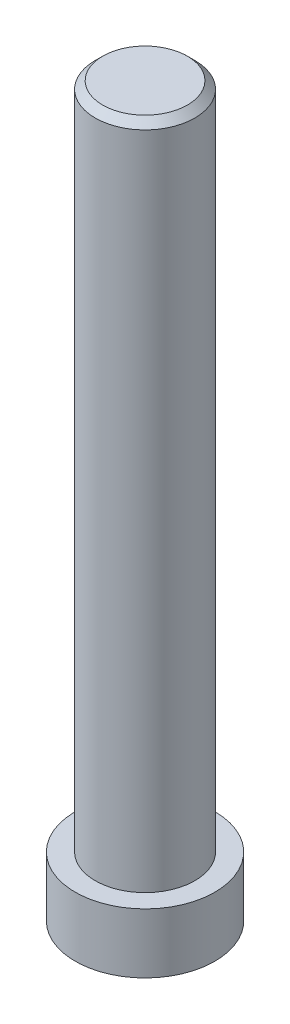
ISO-10303-21;
HEADER;
FILE_DESCRIPTION(('STEP AP214'),'2;1');
FILE_NAME('part.step','',(''),(''),'','','');
FILE_SCHEMA(('AUTOMOTIVE_DESIGN { 1 0 10303 214 1 1 1 1 }'));
ENDSEC;
DATA;
#1=APPLICATION_CONTEXT('core data for automotive mechanical design processes');
#2=APPLICATION_PROTOCOL_DEFINITION('international standard','automotive_design',2000,#1);
#3=PRODUCT_CONTEXT('',#1,'mechanical');
#4=PRODUCT('Part','Part','',(#3));
#5=PRODUCT_RELATED_PRODUCT_CATEGORY('part','',(#4));
#6=PRODUCT_DEFINITION_FORMATION('','',#4);
#7=PRODUCT_DEFINITION_CONTEXT('part definition',#1,'design');
#8=PRODUCT_DEFINITION('design','',#6,#7);
#9=PRODUCT_DEFINITION_SHAPE('','',#8);
#10=(LENGTH_UNIT() NAMED_UNIT(*) SI_UNIT(.MILLI.,.METRE.));
#11=(NAMED_UNIT(*) PLANE_ANGLE_UNIT() SI_UNIT($,.RADIAN.));
#12=(NAMED_UNIT(*) SI_UNIT($,.STERADIAN.) SOLID_ANGLE_UNIT());
#13=UNCERTAINTY_MEASURE_WITH_UNIT(LENGTH_MEASURE(1.E-05),#10,'distance_accuracy_value','');
#14=(GEOMETRIC_REPRESENTATION_CONTEXT(3) GLOBAL_UNCERTAINTY_ASSIGNED_CONTEXT((#13)) GLOBAL_UNIT_ASSIGNED_CONTEXT((#10,
#11,#12)) REPRESENTATION_CONTEXT('',''));
#15=CARTESIAN_POINT('',(0.,0.,0.));
#16=DIRECTION('',(0.,0.,1.));
#17=DIRECTION('',(1.,0.,0.));
#18=AXIS2_PLACEMENT_3D('',#15,#16,#17);
#19=CARTESIAN_POINT('',(0.,67.,0.));
#20=DIRECTION('',(0.,-1.,0.));
#21=DIRECTION('',(0.,0.,-1.));
#22=AXIS2_PLACEMENT_3D('',#19,#20,#21);
#23=CYLINDRICAL_SURFACE('',#22,5.);
#24=CARTESIAN_POINT('',(0.,66.25,0.));
#25=DIRECTION('',(0.,1.,0.));
#26=DIRECTION('',(0.,0.,1.));
#27=AXIS2_PLACEMENT_3D('',#24,#25,#26);
#28=CIRCLE('',#27,5.);
#29=CARTESIAN_POINT('',(0.,66.25,5.));
#30=VERTEX_POINT('',#29);
#31=EDGE_CURVE('E11',#30,#30,#28,.F.);
#32=ORIENTED_EDGE('',*,*,#31,.T.);
#33=EDGE_LOOP('',(#32));
#34=FACE_BOUND('',#33,.T.);
#35=CARTESIAN_POINT('',(0.,0.,0.));
#36=DIRECTION('',(0.,-1.,0.));
#37=DIRECTION('',(0.,0.,-1.));
#38=AXIS2_PLACEMENT_3D('',#35,#36,#37);
#39=CIRCLE('',#38,5.);
#40=CARTESIAN_POINT('',(0.,0.,-5.));
#41=VERTEX_POINT('',#40);
#42=EDGE_CURVE('E152',#41,#41,#39,.T.);
#43=ORIENTED_EDGE('',*,*,#42,.F.);
#44=EDGE_LOOP('',(#43));
#45=FACE_BOUND('',#44,.T.);
#46=ADVANCED_FACE('F41',(#34,#45),#23,.T.);
#47=CARTESIAN_POINT('',(0.,67.,0.));
#48=DIRECTION('',(0.,1.,0.));
#49=DIRECTION('',(0.,0.,1.));
#50=AXIS2_PLACEMENT_3D('',#47,#48,#49);
#51=PLANE('',#50);
#52=CARTESIAN_POINT('',(0.,67.,0.));
#53=DIRECTION('',(0.,1.,0.));
#54=DIRECTION('',(0.,0.,1.));
#55=AXIS2_PLACEMENT_3D('',#52,#53,#54);
#56=CIRCLE('',#55,4.25);
#57=CARTESIAN_POINT('',(0.,67.,4.25));
#58=VERTEX_POINT('',#57);
#59=EDGE_CURVE('E49',#58,#58,#56,.T.);
#60=ORIENTED_EDGE('',*,*,#59,.T.);
#61=EDGE_LOOP('',(#60));
#62=FACE_BOUND('',#61,.T.);
#63=ADVANCED_FACE('F159',(#62),#51,.T.);
#64=CARTESIAN_POINT('',(0.,67.,0.));
#65=DIRECTION('',(0.,-1.,0.));
#66=DIRECTION('',(0.,0.,-1.));
#67=AXIS2_PLACEMENT_3D('',#64,#65,#66);
#68=CONICAL_SURFACE('',#67,4.25,0.785398163397445);
#69=ORIENTED_EDGE('',*,*,#31,.F.);
#70=EDGE_LOOP('',(#69));
#71=FACE_BOUND('',#70,.T.);
#72=ORIENTED_EDGE('',*,*,#59,.F.);
#73=EDGE_LOOP('',(#72));
#74=FACE_BOUND('',#73,.T.);
#75=ADVANCED_FACE('F43',(#71,#74),#68,.T.);
#76=CARTESIAN_POINT('',(0.,0.,0.));
#77=DIRECTION('',(0.,-1.,0.));
#78=DIRECTION('',(0.,0.,-1.));
#79=AXIS2_PLACEMENT_3D('',#76,#77,#78);
#80=PLANE('',#79);
#81=CARTESIAN_POINT('',(0.,0.,0.));
#82=DIRECTION('',(0.,-1.,0.));
#83=DIRECTION('',(0.,0.,-1.));
#84=AXIS2_PLACEMENT_3D('',#81,#82,#83);
#85=CIRCLE('',#84,7.);
#86=CARTESIAN_POINT('',(0.,0.,-7.));
#87=VERTEX_POINT('',#86);
#88=EDGE_CURVE('E143',#87,#87,#85,.T.);
#89=ORIENTED_EDGE('',*,*,#88,.F.);
#90=EDGE_LOOP('',(#89));
#91=FACE_BOUND('',#90,.T.);
#92=ORIENTED_EDGE('',*,*,#42,.T.);
#93=EDGE_LOOP('',(#92));
#94=FACE_BOUND('',#93,.T.);
#95=ADVANCED_FACE('F162',(#91,#94),#80,.F.);
#96=CARTESIAN_POINT('',(0.,-6.,0.));
#97=DIRECTION('',(0.,1.,0.));
#98=DIRECTION('',(0.,0.,1.));
#99=AXIS2_PLACEMENT_3D('',#96,#97,#98);
#100=CYLINDRICAL_SURFACE('',#99,7.);
#101=CARTESIAN_POINT('',(0.,-6.,0.));
#102=DIRECTION('',(0.,-1.,0.));
#103=DIRECTION('',(0.,0.,-1.));
#104=AXIS2_PLACEMENT_3D('',#101,#102,#103);
#105=CIRCLE('',#104,7.);
#106=CARTESIAN_POINT('',(0.,-6.,-7.));
#107=VERTEX_POINT('',#106);
#108=EDGE_CURVE('E149',#107,#107,#105,.T.);
#109=ORIENTED_EDGE('',*,*,#108,.F.);
#110=EDGE_LOOP('',(#109));
#111=FACE_BOUND('',#110,.T.);
#112=ORIENTED_EDGE('',*,*,#88,.T.);
#113=EDGE_LOOP('',(#112));
#114=FACE_BOUND('',#113,.T.);
#115=ADVANCED_FACE('F168',(#111,#114),#100,.T.);
#116=CARTESIAN_POINT('',(0.,-6.,0.));
#117=DIRECTION('',(0.,-1.,0.));
#118=DIRECTION('',(0.,0.,-1.));
#119=AXIS2_PLACEMENT_3D('',#116,#117,#118);
#120=PLANE('',#119);
#121=DIRECTION('',(-0.866025403784439,0.,0.5));
#122=VECTOR('',#121,1.);
#123=CARTESIAN_POINT('',(2.6,-6.,1.50111069989303));
#124=LINE('',#123,#122);
#125=CARTESIAN_POINT('',(2.6,-6.,1.50111069989303));
#126=VERTEX_POINT('',#125);
#127=CARTESIAN_POINT('',(0.,-6.,3.00222139978605));
#128=VERTEX_POINT('',#127);
#129=EDGE_CURVE('E56',#126,#128,#124,.T.);
#130=ORIENTED_EDGE('',*,*,#129,.F.);
#131=DIRECTION('',(0.,0.,1.));
#132=VECTOR('',#131,1.);
#133=CARTESIAN_POINT('',(2.6,-6.,-1.50111069989303));
#134=LINE('',#133,#132);
#135=CARTESIAN_POINT('',(2.6,-6.,-1.50111069989303));
#136=VERTEX_POINT('',#135);
#137=EDGE_CURVE('E139',#136,#126,#134,.T.);
#138=ORIENTED_EDGE('',*,*,#137,.F.);
#139=DIRECTION('',(0.866025403784439,0.,0.5));
#140=VECTOR('',#139,1.);
#141=CARTESIAN_POINT('',(0.,-6.,-3.00222139978606));
#142=LINE('',#141,#140);
#143=CARTESIAN_POINT('',(0.,-6.,-3.00222139978606));
#144=VERTEX_POINT('',#143);
#145=EDGE_CURVE('E137',#144,#136,#142,.T.);
#146=ORIENTED_EDGE('',*,*,#145,.F.);
#147=DIRECTION('',(0.866025403784439,0.,-0.5));
#148=VECTOR('',#147,1.);
#149=CARTESIAN_POINT('',(-2.6,-6.,-1.50111069989303));
#150=LINE('',#149,#148);
#151=CARTESIAN_POINT('',(-2.6,-6.,-1.50111069989303));
#152=VERTEX_POINT('',#151);
#153=EDGE_CURVE('E104',#152,#144,#150,.T.);
#154=ORIENTED_EDGE('',*,*,#153,.F.);
#155=DIRECTION('',(0.,0.,-1.));
#156=VECTOR('',#155,1.);
#157=CARTESIAN_POINT('',(-2.6,-6.,1.50111069989303));
#158=LINE('',#157,#156);
#159=CARTESIAN_POINT('',(-2.6,-6.,1.50111069989303));
#160=VERTEX_POINT('',#159);
#161=EDGE_CURVE('E133',#160,#152,#158,.T.);
#162=ORIENTED_EDGE('',*,*,#161,.F.);
#163=DIRECTION('',(-0.866025403784439,0.,-0.5));
#164=VECTOR('',#163,1.);
#165=CARTESIAN_POINT('',(0.,-6.,3.00222139978605));
#166=LINE('',#165,#164);
#167=EDGE_CURVE('E130',#128,#160,#166,.T.);
#168=ORIENTED_EDGE('',*,*,#167,.F.);
#169=EDGE_LOOP('',(#130,#138,#146,#154,#162,#168));
#170=FACE_BOUND('',#169,.T.);
#171=ORIENTED_EDGE('',*,*,#108,.T.);
#172=EDGE_LOOP('',(#171));
#173=FACE_BOUND('',#172,.T.);
#174=ADVANCED_FACE('F180',(#170,#173),#120,.T.);
#175=CARTESIAN_POINT('',(2.6,-2.2,1.50111069989303));
#176=DIRECTION('',(0.5,0.,0.866025403784439));
#177=DIRECTION('',(0.866025403784439,0.,-0.5));
#178=AXIS2_PLACEMENT_3D('',#175,#176,#177);
#179=PLANE('',#178);
#180=ORIENTED_EDGE('',*,*,#129,.T.);
#181=DIRECTION('',(0.,-1.,0.));
#182=VECTOR('',#181,1.);
#183=CARTESIAN_POINT('',(0.,-2.2,3.00222139978605));
#184=LINE('',#183,#182);
#185=CARTESIAN_POINT('',(0.,-2.2,3.00222139978605));
#186=VERTEX_POINT('',#185);
#187=EDGE_CURVE('E86',#186,#128,#184,.T.);
#188=ORIENTED_EDGE('',*,*,#187,.F.);
#189=DIRECTION('',(-0.866025403784439,0.,0.5));
#190=VECTOR('',#189,1.);
#191=CARTESIAN_POINT('',(2.6,-2.2,1.50111069989303));
#192=LINE('',#191,#190);
#193=CARTESIAN_POINT('',(2.6,-2.2,1.50111069989303));
#194=VERTEX_POINT('',#193);
#195=EDGE_CURVE('E141',#194,#186,#192,.T.);
#196=ORIENTED_EDGE('',*,*,#195,.F.);
#197=DIRECTION('',(0.,-1.,0.));
#198=VECTOR('',#197,1.);
#199=CARTESIAN_POINT('',(2.6,-2.2,1.50111069989303));
#200=LINE('',#199,#198);
#201=EDGE_CURVE('E64',#194,#126,#200,.T.);
#202=ORIENTED_EDGE('',*,*,#201,.T.);
#203=EDGE_LOOP('',(#180,#188,#196,#202));
#204=FACE_BOUND('',#203,.T.);
#205=ADVANCED_FACE('F185',(#204),#179,.F.);
#206=CARTESIAN_POINT('',(2.6,-2.2,-1.50111069989303));
#207=DIRECTION('',(1.,0.,0.));
#208=DIRECTION('',(0.,0.,-1.));
#209=AXIS2_PLACEMENT_3D('',#206,#207,#208);
#210=PLANE('',#209);
#211=ORIENTED_EDGE('',*,*,#137,.T.);
#212=ORIENTED_EDGE('',*,*,#201,.F.);
#213=DIRECTION('',(0.,0.,1.));
#214=VECTOR('',#213,1.);
#215=CARTESIAN_POINT('',(2.6,-2.2,-1.50111069989303));
#216=LINE('',#215,#214);
#217=CARTESIAN_POINT('',(2.6,-2.2,-1.50111069989303));
#218=VERTEX_POINT('',#217);
#219=EDGE_CURVE('E116',#218,#194,#216,.T.);
#220=ORIENTED_EDGE('',*,*,#219,.F.);
#221=DIRECTION('',(0.,-1.,0.));
#222=VECTOR('',#221,1.);
#223=CARTESIAN_POINT('',(2.6,-2.2,-1.50111069989303));
#224=LINE('',#223,#222);
#225=EDGE_CURVE('E108',#218,#136,#224,.T.);
#226=ORIENTED_EDGE('',*,*,#225,.T.);
#227=EDGE_LOOP('',(#211,#212,#220,#226));
#228=FACE_BOUND('',#227,.T.);
#229=ADVANCED_FACE('F189',(#228),#210,.F.);
#230=CARTESIAN_POINT('',(0.,-2.2,-3.00222139978606));
#231=DIRECTION('',(0.5,0.,-0.866025403784439));
#232=DIRECTION('',(-0.866025403784439,0.,-0.5));
#233=AXIS2_PLACEMENT_3D('',#230,#231,#232);
#234=PLANE('',#233);
#235=ORIENTED_EDGE('',*,*,#145,.T.);
#236=ORIENTED_EDGE('',*,*,#225,.F.);
#237=DIRECTION('',(0.866025403784439,0.,0.5));
#238=VECTOR('',#237,1.);
#239=CARTESIAN_POINT('',(0.,-2.2,-3.00222139978606));
#240=LINE('',#239,#238);
#241=CARTESIAN_POINT('',(0.,-2.2,-3.00222139978606));
#242=VERTEX_POINT('',#241);
#243=EDGE_CURVE('E112',#242,#218,#240,.T.);
#244=ORIENTED_EDGE('',*,*,#243,.F.);
#245=DIRECTION('',(0.,-1.,0.));
#246=VECTOR('',#245,1.);
#247=CARTESIAN_POINT('',(0.,-2.2,-3.00222139978606));
#248=LINE('',#247,#246);
#249=EDGE_CURVE('E97',#242,#144,#248,.T.);
#250=ORIENTED_EDGE('',*,*,#249,.T.);
#251=EDGE_LOOP('',(#235,#236,#244,#250));
#252=FACE_BOUND('',#251,.T.);
#253=ADVANCED_FACE('F113',(#252),#234,.F.);
#254=CARTESIAN_POINT('',(-2.6,-2.2,-1.50111069989303));
#255=DIRECTION('',(-0.5,0.,-0.866025403784438));
#256=DIRECTION('',(-0.866025403784439,0.,0.5));
#257=AXIS2_PLACEMENT_3D('',#254,#255,#256);
#258=PLANE('',#257);
#259=ORIENTED_EDGE('',*,*,#153,.T.);
#260=ORIENTED_EDGE('',*,*,#249,.F.);
#261=DIRECTION('',(0.866025403784439,0.,-0.5));
#262=VECTOR('',#261,1.);
#263=CARTESIAN_POINT('',(-2.6,-2.2,-1.50111069989303));
#264=LINE('',#263,#262);
#265=CARTESIAN_POINT('',(-2.6,-2.2,-1.50111069989303));
#266=VERTEX_POINT('',#265);
#267=EDGE_CURVE('E101',#266,#242,#264,.T.);
#268=ORIENTED_EDGE('',*,*,#267,.F.);
#269=DIRECTION('',(0.,-1.,0.));
#270=VECTOR('',#269,1.);
#271=CARTESIAN_POINT('',(-2.6,-2.2,-1.50111069989303));
#272=LINE('',#271,#270);
#273=EDGE_CURVE('E109',#266,#152,#272,.T.);
#274=ORIENTED_EDGE('',*,*,#273,.T.);
#275=EDGE_LOOP('',(#259,#260,#268,#274));
#276=FACE_BOUND('',#275,.T.);
#277=ADVANCED_FACE('F99',(#276),#258,.F.);
#278=CARTESIAN_POINT('',(-2.6,-2.2,1.50111069989303));
#279=DIRECTION('',(-1.,0.,0.));
#280=DIRECTION('',(0.,0.,1.));
#281=AXIS2_PLACEMENT_3D('',#278,#279,#280);
#282=PLANE('',#281);
#283=ORIENTED_EDGE('',*,*,#161,.T.);
#284=ORIENTED_EDGE('',*,*,#273,.F.);
#285=DIRECTION('',(0.,0.,-1.));
#286=VECTOR('',#285,1.);
#287=CARTESIAN_POINT('',(-2.6,-2.2,1.50111069989303));
#288=LINE('',#287,#286);
#289=CARTESIAN_POINT('',(-2.6,-2.2,1.50111069989303));
#290=VERTEX_POINT('',#289);
#291=EDGE_CURVE('E122',#290,#266,#288,.T.);
#292=ORIENTED_EDGE('',*,*,#291,.F.);
#293=DIRECTION('',(0.,-1.,0.));
#294=VECTOR('',#293,1.);
#295=CARTESIAN_POINT('',(-2.6,-2.2,1.50111069989303));
#296=LINE('',#295,#294);
#297=EDGE_CURVE('E146',#290,#160,#296,.T.);
#298=ORIENTED_EDGE('',*,*,#297,.T.);
#299=EDGE_LOOP('',(#283,#284,#292,#298));
#300=FACE_BOUND('',#299,.T.);
#301=ADVANCED_FACE('F193',(#300),#282,.F.);
#302=CARTESIAN_POINT('',(0.,-2.2,3.00222139978605));
#303=DIRECTION('',(-0.5,0.,0.866025403784439));
#304=DIRECTION('',(0.866025403784439,0.,0.5));
#305=AXIS2_PLACEMENT_3D('',#302,#303,#304);
#306=PLANE('',#305);
#307=ORIENTED_EDGE('',*,*,#167,.T.);
#308=ORIENTED_EDGE('',*,*,#297,.F.);
#309=DIRECTION('',(-0.866025403784439,0.,-0.5));
#310=VECTOR('',#309,1.);
#311=CARTESIAN_POINT('',(0.,-2.2,3.00222139978605));
#312=LINE('',#311,#310);
#313=EDGE_CURVE('E124',#186,#290,#312,.T.);
#314=ORIENTED_EDGE('',*,*,#313,.F.);
#315=ORIENTED_EDGE('',*,*,#187,.T.);
#316=EDGE_LOOP('',(#307,#308,#314,#315));
#317=FACE_BOUND('',#316,.T.);
#318=ADVANCED_FACE('F190',(#317),#306,.F.);
#319=CARTESIAN_POINT('',(0.,-2.2,3.00222139978605));
#320=DIRECTION('',(0.,-1.,0.));
#321=DIRECTION('',(0.,0.,-1.));
#322=AXIS2_PLACEMENT_3D('',#319,#320,#321);
#323=PLANE('',#322);
#324=ORIENTED_EDGE('',*,*,#195,.T.);
#325=ORIENTED_EDGE('',*,*,#313,.T.);
#326=ORIENTED_EDGE('',*,*,#291,.T.);
#327=ORIENTED_EDGE('',*,*,#267,.T.);
#328=ORIENTED_EDGE('',*,*,#243,.T.);
#329=ORIENTED_EDGE('',*,*,#219,.T.);
#330=EDGE_LOOP('',(#324,#325,#326,#327,#328,#329));
#331=FACE_BOUND('',#330,.T.);
#332=ADVANCED_FACE('F119',(#331),#323,.T.);
#333=CLOSED_SHELL('',(#46,#63,#75,#95,#115,#174,#205,#229,#253,#277,#301,#318,#332));
#334=MANIFOLD_SOLID_BREP('B2',#333);
#335=ADVANCED_BREP_SHAPE_REPRESENTATION('',(#18,#334),#14);
#336=SHAPE_DEFINITION_REPRESENTATION(#9,#335);
ENDSEC;
END-ISO-10303-21;
